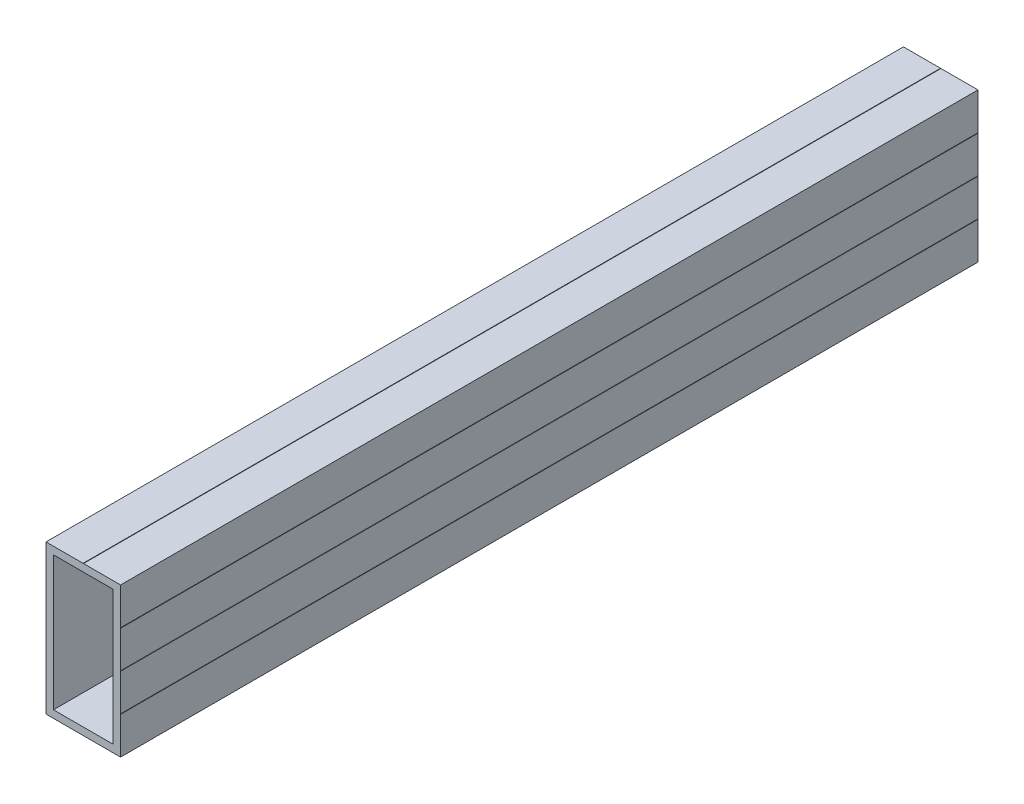
ISO-10303-21;
HEADER;
FILE_DESCRIPTION(('STEP AP214'),'2;1');
FILE_NAME('part.step','',(''),(''),'','','');
FILE_SCHEMA(('AUTOMOTIVE_DESIGN { 1 0 10303 214 1 1 1 1 }'));
ENDSEC;
DATA;
#1=APPLICATION_CONTEXT('core data for automotive mechanical design processes');
#2=APPLICATION_PROTOCOL_DEFINITION('international standard','automotive_design',2000,#1);
#3=PRODUCT_CONTEXT('',#1,'mechanical');
#4=PRODUCT('Part','Part','',(#3));
#5=PRODUCT_RELATED_PRODUCT_CATEGORY('part','',(#4));
#6=PRODUCT_DEFINITION_FORMATION('','',#4);
#7=PRODUCT_DEFINITION_CONTEXT('part definition',#1,'design');
#8=PRODUCT_DEFINITION('design','',#6,#7);
#9=PRODUCT_DEFINITION_SHAPE('','',#8);
#10=(LENGTH_UNIT() NAMED_UNIT(*) SI_UNIT(.MILLI.,.METRE.));
#11=(NAMED_UNIT(*) PLANE_ANGLE_UNIT() SI_UNIT($,.RADIAN.));
#12=(NAMED_UNIT(*) SI_UNIT($,.STERADIAN.) SOLID_ANGLE_UNIT());
#13=UNCERTAINTY_MEASURE_WITH_UNIT(LENGTH_MEASURE(1.E-05),#10,'distance_accuracy_value','');
#14=(GEOMETRIC_REPRESENTATION_CONTEXT(3) GLOBAL_UNCERTAINTY_ASSIGNED_CONTEXT((#13)) GLOBAL_UNIT_ASSIGNED_CONTEXT((#10,
#11,#12)) REPRESENTATION_CONTEXT('',''));
#15=CARTESIAN_POINT('',(0.,0.,0.));
#16=DIRECTION('',(0.,0.,1.));
#17=DIRECTION('',(1.,0.,0.));
#18=AXIS2_PLACEMENT_3D('',#15,#16,#17);
#19=CARTESIAN_POINT('',(-12.7,0.,0.));
#20=DIRECTION('',(1.,0.,0.));
#21=DIRECTION('',(0.,0.,-1.));
#22=AXIS2_PLACEMENT_3D('',#19,#20,#21);
#23=PLANE('',#22);
#24=DIRECTION('',(0.,0.,1.));
#25=VECTOR('',#24,1.);
#26=CARTESIAN_POINT('',(-12.7,25.4,-749.3));
#27=LINE('',#26,#25);
#28=CARTESIAN_POINT('',(-12.7,25.4,457.2));
#29=VERTEX_POINT('',#28);
#30=CARTESIAN_POINT('',(-12.7,25.4,749.3));
#31=VERTEX_POINT('',#30);
#32=EDGE_CURVE('E335',#29,#31,#27,.T.);
#33=ORIENTED_EDGE('',*,*,#32,.F.);
#34=DIRECTION('',(0.,-1.,0.));
#35=VECTOR('',#34,1.);
#36=CARTESIAN_POINT('',(-12.7,0.,457.2));
#37=LINE('',#36,#35);
#38=CARTESIAN_POINT('',(-12.7000000000132,12.7762,457.2));
#39=VERTEX_POINT('',#38);
#40=EDGE_CURVE('E408',#29,#39,#37,.T.);
#41=ORIENTED_EDGE('',*,*,#40,.T.);
#42=DIRECTION('',(0.,0.,1.));
#43=VECTOR('',#42,1.);
#44=CARTESIAN_POINT('',(-12.7000000000132,12.7762,-749.3));
#45=LINE('',#44,#43);
#46=CARTESIAN_POINT('',(-12.7000000000132,12.7762,749.3));
#47=VERTEX_POINT('',#46);
#48=EDGE_CURVE('E271',#39,#47,#45,.T.);
#49=ORIENTED_EDGE('',*,*,#48,.T.);
#50=DIRECTION('',(0.,-1.,0.));
#51=VECTOR('',#50,1.);
#52=CARTESIAN_POINT('',(-12.7,25.4,749.3));
#53=LINE('',#52,#51);
#54=EDGE_CURVE('E339',#31,#47,#53,.T.);
#55=ORIENTED_EDGE('',*,*,#54,.F.);
#56=EDGE_LOOP('',(#33,#41,#49,#55));
#57=FACE_BOUND('',#56,.T.);
#58=ADVANCED_FACE('F34',(#57),#23,.F.);
#59=DIRECTION('',(0.,0.,-1.));
#60=VECTOR('',#59,1.);
#61=CARTESIAN_POINT('',(-12.7,12.6238000000132,0.));
#62=LINE('',#61,#60);
#63=CARTESIAN_POINT('',(-12.7,12.6238000000132,457.2));
#64=VERTEX_POINT('',#63);
#65=CARTESIAN_POINT('',(-12.7,12.6238000000132,749.3));
#66=VERTEX_POINT('',#65);
#67=EDGE_CURVE('E273',#64,#66,#62,.F.);
#68=ORIENTED_EDGE('',*,*,#67,.F.);
#69=DIRECTION('',(0.,-1.,0.));
#70=VECTOR('',#69,1.);
#71=CARTESIAN_POINT('',(-12.7,0.,457.2));
#72=LINE('',#71,#70);
#73=CARTESIAN_POINT('',(-12.7,0.0761999999999976,457.2));
#74=VERTEX_POINT('',#73);
#75=EDGE_CURVE('E49',#64,#74,#72,.T.);
#76=ORIENTED_EDGE('',*,*,#75,.T.);
#77=DIRECTION('',(0.,0.,1.));
#78=VECTOR('',#77,1.);
#79=CARTESIAN_POINT('',(-12.7,0.0761999999999976,-749.3));
#80=LINE('',#79,#78);
#81=CARTESIAN_POINT('',(-12.7,0.0761999999999976,749.3));
#82=VERTEX_POINT('',#81);
#83=EDGE_CURVE('E279',#74,#82,#80,.T.);
#84=ORIENTED_EDGE('',*,*,#83,.T.);
#85=EDGE_CURVE('E343',#66,#82,#53,.T.);
#86=ORIENTED_EDGE('',*,*,#85,.F.);
#87=EDGE_LOOP('',(#68,#76,#84,#86));
#88=FACE_BOUND('',#87,.T.);
#89=ADVANCED_FACE('F513',(#88),#23,.F.);
#90=DIRECTION('',(0.,0.,-1.));
#91=VECTOR('',#90,1.);
#92=CARTESIAN_POINT('',(-12.7,-0.0761999999999985,0.));
#93=LINE('',#92,#91);
#94=CARTESIAN_POINT('',(-12.7,-0.0761999999999982,457.2));
#95=VERTEX_POINT('',#94);
#96=CARTESIAN_POINT('',(-12.7,-0.0761999999999985,749.3));
#97=VERTEX_POINT('',#96);
#98=EDGE_CURVE('E281',#95,#97,#93,.F.);
#99=ORIENTED_EDGE('',*,*,#98,.F.);
#100=DIRECTION('',(0.,-1.,0.));
#101=VECTOR('',#100,1.);
#102=CARTESIAN_POINT('',(-12.7,0.,457.2));
#103=LINE('',#102,#101);
#104=CARTESIAN_POINT('',(-12.7,-12.6238,457.2));
#105=VERTEX_POINT('',#104);
#106=EDGE_CURVE('E430',#95,#105,#103,.T.);
#107=ORIENTED_EDGE('',*,*,#106,.T.);
#108=DIRECTION('',(0.,0.,1.));
#109=VECTOR('',#108,1.);
#110=CARTESIAN_POINT('',(-12.7,-12.6238,-749.3));
#111=LINE('',#110,#109);
#112=CARTESIAN_POINT('',(-12.7,-12.6238,749.3));
#113=VERTEX_POINT('',#112);
#114=EDGE_CURVE('E290',#105,#113,#111,.T.);
#115=ORIENTED_EDGE('',*,*,#114,.T.);
#116=EDGE_CURVE('E596',#97,#113,#53,.T.);
#117=ORIENTED_EDGE('',*,*,#116,.F.);
#118=EDGE_LOOP('',(#99,#107,#115,#117));
#119=FACE_BOUND('',#118,.T.);
#120=ADVANCED_FACE('F505',(#119),#23,.F.);
#121=CARTESIAN_POINT('',(-12.7,-25.4,749.3));
#122=DIRECTION('',(0.,-1.,0.));
#123=DIRECTION('',(0.,0.,-1.));
#124=AXIS2_PLACEMENT_3D('',#121,#122,#123);
#125=PLANE('',#124);
#126=DIRECTION('',(-1.,0.,0.));
#127=VECTOR('',#126,1.);
#128=CARTESIAN_POINT('',(-12.7,-25.4,457.2));
#129=LINE('',#128,#127);
#130=CARTESIAN_POINT('',(-0.0762000000000089,-25.4,457.2));
#131=VERTEX_POINT('',#130);
#132=CARTESIAN_POINT('',(-12.7,-25.4,457.2));
#133=VERTEX_POINT('',#132);
#134=EDGE_CURVE('E452',#131,#133,#129,.T.);
#135=ORIENTED_EDGE('',*,*,#134,.F.);
#136=DIRECTION('',(0.,0.,1.));
#137=VECTOR('',#136,1.);
#138=CARTESIAN_POINT('',(-0.0762000000000087,-25.4,-749.3));
#139=LINE('',#138,#137);
#140=CARTESIAN_POINT('',(-0.0762000000000087,-25.4,749.3));
#141=VERTEX_POINT('',#140);
#142=EDGE_CURVE('E296',#131,#141,#139,.T.);
#143=ORIENTED_EDGE('',*,*,#142,.T.);
#144=DIRECTION('',(1.,0.,0.));
#145=VECTOR('',#144,1.);
#146=CARTESIAN_POINT('',(-12.7,-25.4,749.3));
#147=LINE('',#146,#145);
#148=CARTESIAN_POINT('',(-12.7,-25.4,749.3));
#149=VERTEX_POINT('',#148);
#150=EDGE_CURVE('E42',#149,#141,#147,.T.);
#151=ORIENTED_EDGE('',*,*,#150,.F.);
#152=DIRECTION('',(0.,0.,-1.));
#153=VECTOR('',#152,1.);
#154=CARTESIAN_POINT('',(-12.7,-25.4,749.3));
#155=LINE('',#154,#153);
#156=EDGE_CURVE('E342',#149,#133,#155,.T.);
#157=ORIENTED_EDGE('',*,*,#156,.T.);
#158=EDGE_LOOP('',(#135,#143,#151,#157));
#159=FACE_BOUND('',#158,.T.);
#160=ADVANCED_FACE('F510',(#159),#125,.T.);
#161=CARTESIAN_POINT('',(12.7,0.,0.));
#162=DIRECTION('',(1.,0.,0.));
#163=DIRECTION('',(0.,0.,-1.));
#164=AXIS2_PLACEMENT_3D('',#161,#162,#163);
#165=PLANE('',#164);
#166=DIRECTION('',(0.,-1.,0.));
#167=VECTOR('',#166,1.);
#168=CARTESIAN_POINT('',(12.7,0.,457.2));
#169=LINE('',#168,#167);
#170=CARTESIAN_POINT('',(12.7,-12.7762,457.2));
#171=VERTEX_POINT('',#170);
#172=CARTESIAN_POINT('',(12.7,-25.4,457.2));
#173=VERTEX_POINT('',#172);
#174=EDGE_CURVE('E476',#171,#173,#169,.T.);
#175=ORIENTED_EDGE('',*,*,#174,.F.);
#176=DIRECTION('',(0.,0.,1.));
#177=VECTOR('',#176,1.);
#178=CARTESIAN_POINT('',(12.7,-12.7762,-749.3));
#179=LINE('',#178,#177);
#180=CARTESIAN_POINT('',(12.7,-12.7762,749.3));
#181=VERTEX_POINT('',#180);
#182=EDGE_CURVE('E305',#171,#181,#179,.T.);
#183=ORIENTED_EDGE('',*,*,#182,.T.);
#184=DIRECTION('',(0.,-1.,0.));
#185=VECTOR('',#184,1.);
#186=CARTESIAN_POINT('',(12.7,25.4,749.3));
#187=LINE('',#186,#185);
#188=CARTESIAN_POINT('',(12.7,-25.4,749.3));
#189=VERTEX_POINT('',#188);
#190=EDGE_CURVE('E349',#181,#189,#187,.T.);
#191=ORIENTED_EDGE('',*,*,#190,.T.);
#192=DIRECTION('',(0.,0.,-1.));
#193=VECTOR('',#192,1.);
#194=CARTESIAN_POINT('',(12.7,-25.4,749.3));
#195=LINE('',#194,#193);
#196=EDGE_CURVE('E338',#189,#173,#195,.T.);
#197=ORIENTED_EDGE('',*,*,#196,.T.);
#198=EDGE_LOOP('',(#175,#183,#191,#197));
#199=FACE_BOUND('',#198,.T.);
#200=ADVANCED_FACE('F525',(#199),#165,.T.);
#201=DIRECTION('',(0.,-1.,0.));
#202=VECTOR('',#201,1.);
#203=CARTESIAN_POINT('',(12.7,0.,457.2));
#204=LINE('',#203,#202);
#205=CARTESIAN_POINT('',(12.7,-0.0762000000000003,457.2));
#206=VERTEX_POINT('',#205);
#207=CARTESIAN_POINT('',(12.7,-12.6238,457.2));
#208=VERTEX_POINT('',#207);
#209=EDGE_CURVE('E463',#206,#208,#204,.T.);
#210=ORIENTED_EDGE('',*,*,#209,.F.);
#211=DIRECTION('',(0.,0.,1.));
#212=VECTOR('',#211,1.);
#213=CARTESIAN_POINT('',(12.7,-0.0762000000000003,-749.3));
#214=LINE('',#213,#212);
#215=CARTESIAN_POINT('',(12.7,-0.0762000000000003,749.3));
#216=VERTEX_POINT('',#215);
#217=EDGE_CURVE('E313',#206,#216,#214,.T.);
#218=ORIENTED_EDGE('',*,*,#217,.T.);
#219=CARTESIAN_POINT('',(12.7,-12.6238,749.3));
#220=VERTEX_POINT('',#219);
#221=EDGE_CURVE('E557',#216,#220,#187,.T.);
#222=ORIENTED_EDGE('',*,*,#221,.T.);
#223=DIRECTION('',(0.,0.,-1.));
#224=VECTOR('',#223,1.);
#225=CARTESIAN_POINT('',(12.7,-12.6238,0.));
#226=LINE('',#225,#224);
#227=EDGE_CURVE('E307',#208,#220,#226,.F.);
#228=ORIENTED_EDGE('',*,*,#227,.F.);
#229=EDGE_LOOP('',(#210,#218,#222,#228));
#230=FACE_BOUND('',#229,.T.);
#231=ADVANCED_FACE('F534',(#230),#165,.T.);
#232=DIRECTION('',(0.,-1.,0.));
#233=VECTOR('',#232,1.);
#234=CARTESIAN_POINT('',(12.7,0.,457.2));
#235=LINE('',#234,#233);
#236=CARTESIAN_POINT('',(12.6999999999868,12.6238,457.2));
#237=VERTEX_POINT('',#236);
#238=CARTESIAN_POINT('',(12.7,0.0761999999999985,457.2));
#239=VERTEX_POINT('',#238);
#240=EDGE_CURVE('E450',#237,#239,#235,.T.);
#241=ORIENTED_EDGE('',*,*,#240,.F.);
#242=DIRECTION('',(0.,0.,1.));
#243=VECTOR('',#242,1.);
#244=CARTESIAN_POINT('',(12.6999999999868,12.6238,-749.3));
#245=LINE('',#244,#243);
#246=CARTESIAN_POINT('',(12.6999999999868,12.6238,749.3));
#247=VERTEX_POINT('',#246);
#248=EDGE_CURVE('E324',#237,#247,#245,.T.);
#249=ORIENTED_EDGE('',*,*,#248,.T.);
#250=CARTESIAN_POINT('',(12.7,0.0761999999999985,749.3));
#251=VERTEX_POINT('',#250);
#252=EDGE_CURVE('E353',#247,#251,#187,.T.);
#253=ORIENTED_EDGE('',*,*,#252,.T.);
#254=DIRECTION('',(0.,0.,-1.));
#255=VECTOR('',#254,1.);
#256=CARTESIAN_POINT('',(12.7,0.0761999999999985,0.));
#257=LINE('',#256,#255);
#258=EDGE_CURVE('E315',#239,#251,#257,.F.);
#259=ORIENTED_EDGE('',*,*,#258,.F.);
#260=EDGE_LOOP('',(#241,#249,#253,#259));
#261=FACE_BOUND('',#260,.T.);
#262=ADVANCED_FACE('F526',(#261),#165,.T.);
#263=CARTESIAN_POINT('',(-12.7,25.4,-749.3));
#264=DIRECTION('',(0.,1.,0.));
#265=DIRECTION('',(0.,0.,1.));
#266=AXIS2_PLACEMENT_3D('',#263,#264,#265);
#267=PLANE('',#266);
#268=DIRECTION('',(1.,0.,0.));
#269=VECTOR('',#268,1.);
#270=CARTESIAN_POINT('',(-12.7,25.4,457.2));
#271=LINE('',#270,#269);
#272=CARTESIAN_POINT('',(0.0761999999999968,25.4,457.2));
#273=VERTEX_POINT('',#272);
#274=CARTESIAN_POINT('',(12.7,25.4,457.2));
#275=VERTEX_POINT('',#274);
#276=EDGE_CURVE('E428',#273,#275,#271,.T.);
#277=ORIENTED_EDGE('',*,*,#276,.F.);
#278=DIRECTION('',(0.,0.,1.));
#279=VECTOR('',#278,1.);
#280=CARTESIAN_POINT('',(0.0761999999999968,25.4,-749.3));
#281=LINE('',#280,#279);
#282=CARTESIAN_POINT('',(0.0761999999999968,25.4,749.3));
#283=VERTEX_POINT('',#282);
#284=EDGE_CURVE('E329',#273,#283,#281,.T.);
#285=ORIENTED_EDGE('',*,*,#284,.T.);
#286=DIRECTION('',(1.,0.,0.));
#287=VECTOR('',#286,1.);
#288=CARTESIAN_POINT('',(-12.7,25.4,749.3));
#289=LINE('',#288,#287);
#290=CARTESIAN_POINT('',(12.7,25.4,749.3));
#291=VERTEX_POINT('',#290);
#292=EDGE_CURVE('E346',#283,#291,#289,.T.);
#293=ORIENTED_EDGE('',*,*,#292,.T.);
#294=DIRECTION('',(0.,0.,1.));
#295=VECTOR('',#294,1.);
#296=CARTESIAN_POINT('',(12.7,25.4,-749.3));
#297=LINE('',#296,#295);
#298=EDGE_CURVE('E347',#275,#291,#297,.T.);
#299=ORIENTED_EDGE('',*,*,#298,.F.);
#300=EDGE_LOOP('',(#277,#285,#293,#299));
#301=FACE_BOUND('',#300,.T.);
#302=ADVANCED_FACE('F537',(#301),#267,.T.);
#303=DIRECTION('',(1.,0.,0.));
#304=VECTOR('',#303,1.);
#305=CARTESIAN_POINT('',(-12.7,25.4,457.2));
#306=LINE('',#305,#304);
#307=CARTESIAN_POINT('',(-0.0761999999999985,25.4,457.2));
#308=VERTEX_POINT('',#307);
#309=EDGE_CURVE('E413',#29,#308,#306,.T.);
#310=ORIENTED_EDGE('',*,*,#309,.F.);
#311=ORIENTED_EDGE('',*,*,#32,.T.);
#312=CARTESIAN_POINT('',(-0.0761999999999985,25.4,749.3));
#313=VERTEX_POINT('',#312);
#314=EDGE_CURVE('E359',#31,#313,#289,.T.);
#315=ORIENTED_EDGE('',*,*,#314,.T.);
#316=DIRECTION('',(0.,0.,1.));
#317=VECTOR('',#316,1.);
#318=CARTESIAN_POINT('',(-0.0761999999999985,25.4,-749.3));
#319=LINE('',#318,#317);
#320=EDGE_CURVE('E331',#308,#313,#319,.T.);
#321=ORIENTED_EDGE('',*,*,#320,.F.);
#322=EDGE_LOOP('',(#310,#311,#315,#321));
#323=FACE_BOUND('',#322,.T.);
#324=ADVANCED_FACE('F507',(#323),#267,.T.);
#325=DIRECTION('',(-1.,0.,0.));
#326=VECTOR('',#325,1.);
#327=CARTESIAN_POINT('',(-12.7,-25.4,457.2));
#328=LINE('',#327,#326);
#329=CARTESIAN_POINT('',(0.0761999999999916,-25.4,457.2));
#330=VERTEX_POINT('',#329);
#331=EDGE_CURVE('E474',#173,#330,#328,.T.);
#332=ORIENTED_EDGE('',*,*,#331,.F.);
#333=ORIENTED_EDGE('',*,*,#196,.F.);
#334=CARTESIAN_POINT('',(0.0761999999999898,-25.4,749.3));
#335=VERTEX_POINT('',#334);
#336=EDGE_CURVE('E358',#335,#189,#147,.T.);
#337=ORIENTED_EDGE('',*,*,#336,.F.);
#338=DIRECTION('',(0.,0.,1.));
#339=VECTOR('',#338,1.);
#340=CARTESIAN_POINT('',(0.0761999999999916,-25.4,-749.3));
#341=LINE('',#340,#339);
#342=EDGE_CURVE('E300',#330,#335,#341,.T.);
#343=ORIENTED_EDGE('',*,*,#342,.F.);
#344=EDGE_LOOP('',(#332,#333,#337,#343));
#345=FACE_BOUND('',#344,.T.);
#346=ADVANCED_FACE('F495',(#345),#125,.T.);
#347=CARTESIAN_POINT('',(-12.7,25.4,749.3));
#348=DIRECTION('',(0.,0.,1.));
#349=DIRECTION('',(1.,0.,0.));
#350=AXIS2_PLACEMENT_3D('',#347,#348,#349);
#351=PLANE('',#350);
#352=DIRECTION('',(1.,0.,0.));
#353=VECTOR('',#352,1.);
#354=CARTESIAN_POINT('',(-10.16,-22.86,749.3));
#355=LINE('',#354,#353);
#356=CARTESIAN_POINT('',(-10.16,-22.86,749.3));
#357=VERTEX_POINT('',#356);
#358=CARTESIAN_POINT('',(10.16,-22.86,749.3));
#359=VERTEX_POINT('',#358);
#360=EDGE_CURVE('E478',#357,#359,#355,.T.);
#361=ORIENTED_EDGE('',*,*,#360,.F.);
#362=DIRECTION('',(0.,-1.,0.));
#363=VECTOR('',#362,1.);
#364=CARTESIAN_POINT('',(-10.16,22.86,749.3));
#365=LINE('',#364,#363);
#366=CARTESIAN_POINT('',(-10.16,22.86,749.3));
#367=VERTEX_POINT('',#366);
#368=EDGE_CURVE('E263',#367,#357,#365,.T.);
#369=ORIENTED_EDGE('',*,*,#368,.F.);
#370=DIRECTION('',(-1.,0.,0.));
#371=VECTOR('',#370,1.);
#372=CARTESIAN_POINT('',(10.16,22.86,749.3));
#373=LINE('',#372,#371);
#374=CARTESIAN_POINT('',(10.16,22.86,749.3));
#375=VERTEX_POINT('',#374);
#376=EDGE_CURVE('E482',#375,#367,#373,.T.);
#377=ORIENTED_EDGE('',*,*,#376,.F.);
#378=DIRECTION('',(0.,1.,0.));
#379=VECTOR('',#378,1.);
#380=CARTESIAN_POINT('',(10.16,-22.86,749.3));
#381=LINE('',#380,#379);
#382=EDGE_CURVE('E257',#359,#375,#381,.T.);
#383=ORIENTED_EDGE('',*,*,#382,.F.);
#384=EDGE_LOOP('',(#361,#369,#377,#383));
#385=FACE_BOUND('',#384,.T.);
#386=DIRECTION('',(-0.707106781186539,0.707106781186555,0.));
#387=VECTOR('',#386,1.);
#388=CARTESIAN_POINT('',(-12.5476000000263,12.6238000000132,749.3));
#389=LINE('',#388,#387);
#390=CARTESIAN_POINT('',(-12.6238000000066,12.6999999999934,749.3));
#391=VERTEX_POINT('',#390);
#392=EDGE_CURVE('E267',#391,#47,#389,.T.);
#393=ORIENTED_EDGE('',*,*,#392,.F.);
#394=DIRECTION('',(-0.707106781247692,-0.707106781125403,0.));
#395=VECTOR('',#394,1.);
#396=CARTESIAN_POINT('',(-6.3119000000066,19.0118999989018,749.3));
#397=LINE('',#396,#395);
#398=EDGE_CURVE('E270',#66,#391,#397,.F.);
#399=ORIENTED_EDGE('',*,*,#398,.F.);
#400=ORIENTED_EDGE('',*,*,#85,.T.);
#401=DIRECTION('',(-1.,0.,0.));
#402=VECTOR('',#401,1.);
#403=CARTESIAN_POINT('',(-12.5476,0.0761999999999985,749.3));
#404=LINE('',#403,#402);
#405=CARTESIAN_POINT('',(-12.5475999999737,0.0761999999999985,749.3));
#406=VERTEX_POINT('',#405);
#407=EDGE_CURVE('E274',#406,#82,#404,.T.);
#408=ORIENTED_EDGE('',*,*,#407,.F.);
#409=DIRECTION('',(-0.707106781247692,-0.707106781125403,0.));
#410=VECTOR('',#409,1.);
#411=CARTESIAN_POINT('',(0.0380999999999923,12.661899997797,749.3));
#412=LINE('',#411,#410);
#413=EDGE_CURVE('E277',#97,#406,#412,.F.);
#414=ORIENTED_EDGE('',*,*,#413,.F.);
#415=ORIENTED_EDGE('',*,*,#116,.T.);
#416=DIRECTION('',(-0.707106781186551,0.707106781186543,0.));
#417=VECTOR('',#416,1.);
#418=CARTESIAN_POINT('',(-12.5476,-12.7762,749.3));
#419=LINE('',#418,#417);
#420=CARTESIAN_POINT('',(-12.6238,-12.7,749.3));
#421=VERTEX_POINT('',#420);
#422=EDGE_CURVE('E282',#421,#113,#419,.T.);
#423=ORIENTED_EDGE('',*,*,#422,.F.);
#424=DIRECTION('',(-0.707106781186537,-0.707106781186558,0.));
#425=VECTOR('',#424,1.);
#426=CARTESIAN_POINT('',(6.38809999999999,6.31190000000056,749.3));
#427=LINE('',#426,#425);
#428=CARTESIAN_POINT('',(-12.7,-12.7762,749.3));
#429=VERTEX_POINT('',#428);
#430=EDGE_CURVE('E285',#429,#421,#427,.F.);
#431=ORIENTED_EDGE('',*,*,#430,.F.);
#432=EDGE_CURVE('E337',#429,#149,#53,.T.);
#433=ORIENTED_EDGE('',*,*,#432,.T.);
#434=ORIENTED_EDGE('',*,*,#150,.T.);
#435=DIRECTION('',(0.707106781186552,0.707106781186544,0.));
#436=VECTOR('',#435,1.);
#437=CARTESIAN_POINT('',(19.0118999999999,-6.31190000000029,749.3));
#438=LINE('',#437,#436);
#439=CARTESIAN_POINT('',(0.,-25.3238,749.3));
#440=VERTEX_POINT('',#439);
#441=EDGE_CURVE('E295',#440,#141,#438,.F.);
#442=ORIENTED_EDGE('',*,*,#441,.F.);
#443=DIRECTION('',(-0.707106781186547,0.707106781186548,0.));
#444=VECTOR('',#443,1.);
#445=CARTESIAN_POINT('',(0.0761999999999916,-25.4,749.3));
#446=LINE('',#445,#444);
#447=EDGE_CURVE('E292',#335,#440,#446,.T.);
#448=ORIENTED_EDGE('',*,*,#447,.F.);
#449=ORIENTED_EDGE('',*,*,#336,.T.);
#450=ORIENTED_EDGE('',*,*,#190,.F.);
#451=DIRECTION('',(0.707106781186539,-0.707106781186556,0.));
#452=VECTOR('',#451,1.);
#453=CARTESIAN_POINT('',(12.5476,-12.6238,749.3));
#454=LINE('',#453,#452);
#455=CARTESIAN_POINT('',(12.6238,-12.7,749.3));
#456=VERTEX_POINT('',#455);
#457=EDGE_CURVE('E298',#456,#181,#454,.T.);
#458=ORIENTED_EDGE('',*,*,#457,.F.);
#459=DIRECTION('',(0.707106781186553,0.707106781186542,0.));
#460=VECTOR('',#459,1.);
#461=CARTESIAN_POINT('',(19.0118999999998,-6.3119000000003,749.3));
#462=LINE('',#461,#460);
#463=EDGE_CURVE('E304',#220,#456,#462,.F.);
#464=ORIENTED_EDGE('',*,*,#463,.F.);
#465=ORIENTED_EDGE('',*,*,#221,.F.);
#466=DIRECTION('',(1.,0.,0.));
#467=VECTOR('',#466,1.);
#468=CARTESIAN_POINT('',(12.5476,-0.0761999999999985,749.3));
#469=LINE('',#468,#467);
#470=CARTESIAN_POINT('',(12.5476,-0.0761999999999985,749.3));
#471=VERTEX_POINT('',#470);
#472=EDGE_CURVE('E308',#471,#216,#469,.T.);
#473=ORIENTED_EDGE('',*,*,#472,.F.);
#474=DIRECTION('',(0.707106781186553,0.707106781186542,0.));
#475=VECTOR('',#474,1.);
#476=CARTESIAN_POINT('',(12.6618999999998,0.038099999999798,749.3));
#477=LINE('',#476,#475);
#478=EDGE_CURVE('E311',#251,#471,#477,.F.);
#479=ORIENTED_EDGE('',*,*,#478,.F.);
#480=ORIENTED_EDGE('',*,*,#252,.F.);
#481=DIRECTION('',(0.707106781186544,-0.707106781186552,0.));
#482=VECTOR('',#481,1.);
#483=CARTESIAN_POINT('',(12.5475999999736,12.7762000000132,749.3));
#484=LINE('',#483,#482);
#485=CARTESIAN_POINT('',(12.6237999999868,12.7,749.3));
#486=VERTEX_POINT('',#485);
#487=EDGE_CURVE('E316',#486,#247,#484,.T.);
#488=ORIENTED_EDGE('',*,*,#487,.F.);
#489=DIRECTION('',(0.707106781125415,0.707106781247681,0.));
#490=VECTOR('',#489,1.);
#491=CARTESIAN_POINT('',(6.31190000218278,6.38810000110456,749.3));
#492=LINE('',#491,#490);
#493=CARTESIAN_POINT('',(12.6999999999868,12.7762000000132,749.3));
#494=VERTEX_POINT('',#493);
#495=EDGE_CURVE('E319',#494,#486,#492,.F.);
#496=ORIENTED_EDGE('',*,*,#495,.F.);
#497=EDGE_CURVE('E350',#291,#494,#187,.T.);
#498=ORIENTED_EDGE('',*,*,#497,.F.);
#499=ORIENTED_EDGE('',*,*,#292,.F.);
#500=DIRECTION('',(-0.707106781186552,-0.707106781186543,0.));
#501=VECTOR('',#500,1.);
#502=CARTESIAN_POINT('',(-6.31190000000008,19.0119,749.3));
#503=LINE('',#502,#501);
#504=CARTESIAN_POINT('',(0.,25.3238,749.3));
#505=VERTEX_POINT('',#504);
#506=EDGE_CURVE('E330',#505,#283,#503,.F.);
#507=ORIENTED_EDGE('',*,*,#506,.F.);
#508=DIRECTION('',(0.707106781186548,-0.707106781186547,0.));
#509=VECTOR('',#508,1.);
#510=CARTESIAN_POINT('',(-0.0761999999999985,25.4,749.3));
#511=LINE('',#510,#509);
#512=EDGE_CURVE('E326',#313,#505,#511,.T.);
#513=ORIENTED_EDGE('',*,*,#512,.F.);
#514=ORIENTED_EDGE('',*,*,#314,.F.);
#515=ORIENTED_EDGE('',*,*,#54,.T.);
#516=EDGE_LOOP('',(#393,#399,#400,#408,#414,#415,#423,#431,#433,#434,#442,#448,#449,#450,#458,
#464,#465,#473,#479,#480,#488,#496,#498,#499,#507,#513,#514,#515));
#517=FACE_BOUND('',#516,.T.);
#518=ADVANCED_FACE('F401',(#385,#517),#351,.T.);
#519=DIRECTION('',(0.,0.,1.));
#520=VECTOR('',#519,1.);
#521=CARTESIAN_POINT('',(-12.7,-12.7762,-749.3));
#522=LINE('',#521,#520);
#523=CARTESIAN_POINT('',(-12.7,-12.7762,457.2));
#524=VERTEX_POINT('',#523);
#525=EDGE_CURVE('E287',#524,#429,#522,.T.);
#526=ORIENTED_EDGE('',*,*,#525,.F.);
#527=DIRECTION('',(0.,-1.,0.));
#528=VECTOR('',#527,1.);
#529=CARTESIAN_POINT('',(-12.7,0.,457.2));
#530=LINE('',#529,#528);
#531=EDGE_CURVE('E447',#524,#133,#530,.T.);
#532=ORIENTED_EDGE('',*,*,#531,.T.);
#533=ORIENTED_EDGE('',*,*,#156,.F.);
#534=ORIENTED_EDGE('',*,*,#432,.F.);
#535=EDGE_LOOP('',(#526,#532,#533,#534));
#536=FACE_BOUND('',#535,.T.);
#537=ADVANCED_FACE('F494',(#536),#23,.F.);
#538=DIRECTION('',(0.,-1.,0.));
#539=VECTOR('',#538,1.);
#540=CARTESIAN_POINT('',(12.7,0.,457.2));
#541=LINE('',#540,#539);
#542=CARTESIAN_POINT('',(12.7,12.7762000000132,457.2));
#543=VERTEX_POINT('',#542);
#544=EDGE_CURVE('E436',#275,#543,#541,.T.);
#545=ORIENTED_EDGE('',*,*,#544,.F.);
#546=ORIENTED_EDGE('',*,*,#298,.T.);
#547=ORIENTED_EDGE('',*,*,#497,.T.);
#548=DIRECTION('',(0.,0.,1.));
#549=VECTOR('',#548,1.);
#550=CARTESIAN_POINT('',(12.6999999999868,12.7762000000132,-749.3));
#551=LINE('',#550,#549);
#552=EDGE_CURVE('E321',#543,#494,#551,.T.);
#553=ORIENTED_EDGE('',*,*,#552,.F.);
#554=EDGE_LOOP('',(#545,#546,#547,#553));
#555=FACE_BOUND('',#554,.T.);
#556=ADVANCED_FACE('F502',(#555),#165,.T.);
#557=CARTESIAN_POINT('',(0.0761999999999968,25.4,-749.3));
#558=DIRECTION('',(-0.707106781186543,0.707106781186552,0.));
#559=DIRECTION('',(-0.707106781186552,-0.707106781186543,0.));
#560=AXIS2_PLACEMENT_3D('',#557,#558,#559);
#561=PLANE('',#560);
#562=ORIENTED_EDGE('',*,*,#284,.F.);
#563=DIRECTION('',(0.707106781186552,0.707106781186543,0.));
#564=VECTOR('',#563,1.);
#565=CARTESIAN_POINT('',(0.0761999999999968,25.4,457.2));
#566=LINE('',#565,#564);
#567=CARTESIAN_POINT('',(0.,25.3238,457.2));
#568=VERTEX_POINT('',#567);
#569=EDGE_CURVE('E425',#273,#568,#566,.F.);
#570=ORIENTED_EDGE('',*,*,#569,.T.);
#571=DIRECTION('',(0.,0.,-1.));
#572=VECTOR('',#571,1.);
#573=CARTESIAN_POINT('',(0.,25.3238,-749.3));
#574=LINE('',#573,#572);
#575=EDGE_CURVE('E333',#568,#505,#574,.F.);
#576=ORIENTED_EDGE('',*,*,#575,.T.);
#577=ORIENTED_EDGE('',*,*,#506,.T.);
#578=EDGE_LOOP('',(#562,#570,#576,#577));
#579=FACE_BOUND('',#578,.T.);
#580=ADVANCED_FACE('F523',(#579),#561,.T.);
#581=CARTESIAN_POINT('',(-0.0761999999999985,25.4,-749.3));
#582=DIRECTION('',(-0.707106781186547,-0.707106781186547,0.));
#583=DIRECTION('',(0.707106781186548,-0.707106781186548,0.));
#584=AXIS2_PLACEMENT_3D('',#581,#582,#583);
#585=PLANE('',#584);
#586=ORIENTED_EDGE('',*,*,#575,.F.);
#587=DIRECTION('',(-0.707106781186548,0.707106781186548,0.));
#588=VECTOR('',#587,1.);
#589=CARTESIAN_POINT('',(-0.0761999999999985,25.4,457.2));
#590=LINE('',#589,#588);
#591=EDGE_CURVE('E422',#568,#308,#590,.T.);
#592=ORIENTED_EDGE('',*,*,#591,.T.);
#593=ORIENTED_EDGE('',*,*,#320,.T.);
#594=ORIENTED_EDGE('',*,*,#512,.T.);
#595=EDGE_LOOP('',(#586,#592,#593,#594));
#596=FACE_BOUND('',#595,.T.);
#597=ADVANCED_FACE('F520',(#596),#585,.F.);
#598=CARTESIAN_POINT('',(12.5475999999736,12.7762000000132,-749.3));
#599=DIRECTION('',(-0.707106781186551,-0.707106781186544,0.));
#600=DIRECTION('',(0.707106781186544,-0.707106781186551,0.));
#601=AXIS2_PLACEMENT_3D('',#598,#599,#600);
#602=PLANE('',#601);
#603=ORIENTED_EDGE('',*,*,#248,.F.);
#604=DIRECTION('',(-0.707106781186544,0.707106781186551,0.));
#605=VECTOR('',#604,1.);
#606=CARTESIAN_POINT('',(12.5475999999736,12.7762000000132,457.2));
#607=LINE('',#606,#605);
#608=CARTESIAN_POINT('',(12.6237999999868,12.7,457.2));
#609=VERTEX_POINT('',#608);
#610=EDGE_CURVE('E444',#237,#609,#607,.T.);
#611=ORIENTED_EDGE('',*,*,#610,.T.);
#612=DIRECTION('',(0.,0.,-1.));
#613=VECTOR('',#612,1.);
#614=CARTESIAN_POINT('',(12.6237999999868,12.7,-749.3));
#615=LINE('',#614,#613);
#616=EDGE_CURVE('E323',#609,#486,#615,.F.);
#617=ORIENTED_EDGE('',*,*,#616,.T.);
#618=ORIENTED_EDGE('',*,*,#487,.T.);
#619=EDGE_LOOP('',(#603,#611,#617,#618));
#620=FACE_BOUND('',#619,.T.);
#621=ADVANCED_FACE('F550',(#620),#602,.F.);
#622=CARTESIAN_POINT('',(12.6999999999868,12.7762000000132,-749.3));
#623=DIRECTION('',(0.70710678124768,-0.707106781125414,0.));
#624=DIRECTION('',(0.707106781125415,0.707106781247681,0.));
#625=AXIS2_PLACEMENT_3D('',#622,#623,#624);
#626=PLANE('',#625);
#627=ORIENTED_EDGE('',*,*,#616,.F.);
#628=DIRECTION('',(-0.707106781125415,-0.707106781247681,0.));
#629=VECTOR('',#628,1.);
#630=CARTESIAN_POINT('',(12.6999999999868,12.7762000000132,457.2));
#631=LINE('',#630,#629);
#632=EDGE_CURVE('E441',#609,#543,#631,.F.);
#633=ORIENTED_EDGE('',*,*,#632,.T.);
#634=ORIENTED_EDGE('',*,*,#552,.T.);
#635=ORIENTED_EDGE('',*,*,#495,.T.);
#636=EDGE_LOOP('',(#627,#633,#634,#635));
#637=FACE_BOUND('',#636,.T.);
#638=ADVANCED_FACE('F627',(#637),#626,.T.);
#639=CARTESIAN_POINT('',(12.5476,-0.0761999999999985,-749.3));
#640=DIRECTION('',(0.,-1.,0.));
#641=DIRECTION('',(1.,0.,0.));
#642=AXIS2_PLACEMENT_3D('',#639,#640,#641);
#643=PLANE('',#642);
#644=ORIENTED_EDGE('',*,*,#217,.F.);
#645=DIRECTION('',(-1.,0.,0.));
#646=VECTOR('',#645,1.);
#647=CARTESIAN_POINT('',(12.5476,-0.0761999999999985,457.2));
#648=LINE('',#647,#646);
#649=CARTESIAN_POINT('',(12.5476,-0.0761999999999975,457.2));
#650=VERTEX_POINT('',#649);
#651=EDGE_CURVE('E460',#206,#650,#648,.T.);
#652=ORIENTED_EDGE('',*,*,#651,.T.);
#653=DIRECTION('',(0.,0.,-1.));
#654=VECTOR('',#653,1.);
#655=CARTESIAN_POINT('',(12.5476,-0.0761999999999985,0.));
#656=LINE('',#655,#654);
#657=EDGE_CURVE('E320',#650,#471,#656,.F.);
#658=ORIENTED_EDGE('',*,*,#657,.T.);
#659=ORIENTED_EDGE('',*,*,#472,.T.);
#660=EDGE_LOOP('',(#644,#652,#658,#659));
#661=FACE_BOUND('',#660,.T.);
#662=ADVANCED_FACE('F625',(#661),#643,.F.);
#663=CARTESIAN_POINT('',(12.7,0.0761999999999985,0.));
#664=DIRECTION('',(0.707106781186542,-0.707106781186553,0.));
#665=DIRECTION('',(0.707106781186553,0.707106781186542,0.));
#666=AXIS2_PLACEMENT_3D('',#663,#664,#665);
#667=PLANE('',#666);
#668=ORIENTED_EDGE('',*,*,#657,.F.);
#669=DIRECTION('',(-0.707106781186553,-0.707106781186542,0.));
#670=VECTOR('',#669,1.);
#671=CARTESIAN_POINT('',(12.7,0.0761999999999985,457.2));
#672=LINE('',#671,#670);
#673=EDGE_CURVE('E457',#650,#239,#672,.F.);
#674=ORIENTED_EDGE('',*,*,#673,.T.);
#675=ORIENTED_EDGE('',*,*,#258,.T.);
#676=ORIENTED_EDGE('',*,*,#478,.T.);
#677=EDGE_LOOP('',(#668,#674,#675,#676));
#678=FACE_BOUND('',#677,.T.);
#679=ADVANCED_FACE('F623',(#678),#667,.T.);
#680=CARTESIAN_POINT('',(12.5476,-12.6238,-749.3));
#681=DIRECTION('',(-0.707106781186555,-0.707106781186539,0.));
#682=DIRECTION('',(0.70710678118654,-0.707106781186556,0.));
#683=AXIS2_PLACEMENT_3D('',#680,#681,#682);
#684=PLANE('',#683);
#685=ORIENTED_EDGE('',*,*,#182,.F.);
#686=DIRECTION('',(-0.70710678118654,0.707106781186556,0.));
#687=VECTOR('',#686,1.);
#688=CARTESIAN_POINT('',(12.5476,-12.6238,457.2));
#689=LINE('',#688,#687);
#690=CARTESIAN_POINT('',(12.6238,-12.7,457.2));
#691=VERTEX_POINT('',#690);
#692=EDGE_CURVE('E471',#171,#691,#689,.T.);
#693=ORIENTED_EDGE('',*,*,#692,.T.);
#694=DIRECTION('',(0.,0.,-1.));
#695=VECTOR('',#694,1.);
#696=CARTESIAN_POINT('',(12.6238,-12.7,0.));
#697=LINE('',#696,#695);
#698=EDGE_CURVE('E312',#691,#456,#697,.F.);
#699=ORIENTED_EDGE('',*,*,#698,.T.);
#700=ORIENTED_EDGE('',*,*,#457,.T.);
#701=EDGE_LOOP('',(#685,#693,#699,#700));
#702=FACE_BOUND('',#701,.T.);
#703=ADVANCED_FACE('F619',(#702),#684,.F.);
#704=CARTESIAN_POINT('',(12.7,-12.6238,0.));
#705=DIRECTION('',(0.707106781186542,-0.707106781186553,0.));
#706=DIRECTION('',(0.707106781186553,0.707106781186542,0.));
#707=AXIS2_PLACEMENT_3D('',#704,#705,#706);
#708=PLANE('',#707);
#709=ORIENTED_EDGE('',*,*,#698,.F.);
#710=DIRECTION('',(-0.707106781186553,-0.707106781186542,0.));
#711=VECTOR('',#710,1.);
#712=CARTESIAN_POINT('',(12.7,-12.6238,457.2));
#713=LINE('',#712,#711);
#714=EDGE_CURVE('E468',#691,#208,#713,.F.);
#715=ORIENTED_EDGE('',*,*,#714,.T.);
#716=ORIENTED_EDGE('',*,*,#227,.T.);
#717=ORIENTED_EDGE('',*,*,#463,.T.);
#718=EDGE_LOOP('',(#709,#715,#716,#717));
#719=FACE_BOUND('',#718,.T.);
#720=ADVANCED_FACE('F622',(#719),#708,.T.);
#721=CARTESIAN_POINT('',(-0.0762000000000087,-25.4,-749.3));
#722=DIRECTION('',(0.707106781186543,-0.707106781186551,0.));
#723=DIRECTION('',(0.707106781186552,0.707106781186544,0.));
#724=AXIS2_PLACEMENT_3D('',#721,#722,#723);
#725=PLANE('',#724);
#726=ORIENTED_EDGE('',*,*,#142,.F.);
#727=DIRECTION('',(-0.707106781186552,-0.707106781186544,0.));
#728=VECTOR('',#727,1.);
#729=CARTESIAN_POINT('',(-0.0762000000000087,-25.4,457.2));
#730=LINE('',#729,#728);
#731=CARTESIAN_POINT('',(0.,-25.3238,457.2));
#732=VERTEX_POINT('',#731);
#733=EDGE_CURVE('E454',#131,#732,#730,.F.);
#734=ORIENTED_EDGE('',*,*,#733,.T.);
#735=DIRECTION('',(0.,0.,-1.));
#736=VECTOR('',#735,1.);
#737=CARTESIAN_POINT('',(0.,-25.3238,-749.3));
#738=LINE('',#737,#736);
#739=EDGE_CURVE('E299',#732,#440,#738,.F.);
#740=ORIENTED_EDGE('',*,*,#739,.T.);
#741=ORIENTED_EDGE('',*,*,#441,.T.);
#742=EDGE_LOOP('',(#726,#734,#740,#741));
#743=FACE_BOUND('',#742,.T.);
#744=ADVANCED_FACE('F577',(#743),#725,.T.);
#745=CARTESIAN_POINT('',(0.0761999999999916,-25.4,-749.3));
#746=DIRECTION('',(0.707106781186548,0.707106781186547,0.));
#747=DIRECTION('',(-0.707106781186547,0.707106781186548,0.));
#748=AXIS2_PLACEMENT_3D('',#745,#746,#747);
#749=PLANE('',#748);
#750=ORIENTED_EDGE('',*,*,#739,.F.);
#751=DIRECTION('',(0.707106781186547,-0.707106781186548,0.));
#752=VECTOR('',#751,1.);
#753=CARTESIAN_POINT('',(0.0761999999999916,-25.4,457.2));
#754=LINE('',#753,#752);
#755=EDGE_CURVE('E465',#732,#330,#754,.T.);
#756=ORIENTED_EDGE('',*,*,#755,.T.);
#757=ORIENTED_EDGE('',*,*,#342,.T.);
#758=ORIENTED_EDGE('',*,*,#447,.T.);
#759=EDGE_LOOP('',(#750,#756,#757,#758));
#760=FACE_BOUND('',#759,.T.);
#761=ADVANCED_FACE('F572',(#760),#749,.F.);
#762=CARTESIAN_POINT('',(-12.5476,-12.7762,-749.3));
#763=DIRECTION('',(0.707106781186543,0.707106781186551,0.));
#764=DIRECTION('',(-0.707106781186552,0.707106781186544,0.));
#765=AXIS2_PLACEMENT_3D('',#762,#763,#764);
#766=PLANE('',#765);
#767=ORIENTED_EDGE('',*,*,#114,.F.);
#768=DIRECTION('',(0.707106781186552,-0.707106781186544,0.));
#769=VECTOR('',#768,1.);
#770=CARTESIAN_POINT('',(-12.5476,-12.7762,457.2));
#771=LINE('',#770,#769);
#772=CARTESIAN_POINT('',(-12.6238,-12.7,457.2));
#773=VERTEX_POINT('',#772);
#774=EDGE_CURVE('E433',#105,#773,#771,.T.);
#775=ORIENTED_EDGE('',*,*,#774,.T.);
#776=DIRECTION('',(0.,0.,-1.));
#777=VECTOR('',#776,1.);
#778=CARTESIAN_POINT('',(-12.6238,-12.7,-749.3));
#779=LINE('',#778,#777);
#780=EDGE_CURVE('E289',#773,#421,#779,.F.);
#781=ORIENTED_EDGE('',*,*,#780,.T.);
#782=ORIENTED_EDGE('',*,*,#422,.T.);
#783=EDGE_LOOP('',(#767,#775,#781,#782));
#784=FACE_BOUND('',#783,.T.);
#785=ADVANCED_FACE('F591',(#784),#766,.F.);
#786=CARTESIAN_POINT('',(-12.7,-12.7762,-749.3));
#787=DIRECTION('',(-0.707106781186558,0.707106781186537,0.));
#788=DIRECTION('',(-0.707106781186537,-0.707106781186558,0.));
#789=AXIS2_PLACEMENT_3D('',#786,#787,#788);
#790=PLANE('',#789);
#791=ORIENTED_EDGE('',*,*,#780,.F.);
#792=DIRECTION('',(0.707106781186537,0.707106781186558,0.));
#793=VECTOR('',#792,1.);
#794=CARTESIAN_POINT('',(-12.7,-12.7762,457.2));
#795=LINE('',#794,#793);
#796=EDGE_CURVE('E438',#773,#524,#795,.F.);
#797=ORIENTED_EDGE('',*,*,#796,.T.);
#798=ORIENTED_EDGE('',*,*,#525,.T.);
#799=ORIENTED_EDGE('',*,*,#430,.T.);
#800=EDGE_LOOP('',(#791,#797,#798,#799));
#801=FACE_BOUND('',#800,.T.);
#802=ADVANCED_FACE('F586',(#801),#790,.T.);
#803=CARTESIAN_POINT('',(-12.5476,0.0761999999999985,-749.3));
#804=DIRECTION('',(0.,1.,0.));
#805=DIRECTION('',(-1.,0.,0.));
#806=AXIS2_PLACEMENT_3D('',#803,#804,#805);
#807=PLANE('',#806);
#808=ORIENTED_EDGE('',*,*,#83,.F.);
#809=DIRECTION('',(1.,0.,0.));
#810=VECTOR('',#809,1.);
#811=CARTESIAN_POINT('',(-12.5476,0.0761999999999985,457.2));
#812=LINE('',#811,#810);
#813=CARTESIAN_POINT('',(-12.5475999999737,0.0761999999999985,457.2));
#814=VERTEX_POINT('',#813);
#815=EDGE_CURVE('E410',#74,#814,#812,.T.);
#816=ORIENTED_EDGE('',*,*,#815,.T.);
#817=DIRECTION('',(0.,0.,-1.));
#818=VECTOR('',#817,1.);
#819=CARTESIAN_POINT('',(-12.5475999999737,0.0761999999999985,0.));
#820=LINE('',#819,#818);
#821=EDGE_CURVE('E286',#814,#406,#820,.F.);
#822=ORIENTED_EDGE('',*,*,#821,.T.);
#823=ORIENTED_EDGE('',*,*,#407,.T.);
#824=EDGE_LOOP('',(#808,#816,#822,#823));
#825=FACE_BOUND('',#824,.T.);
#826=ADVANCED_FACE('F604',(#825),#807,.F.);
#827=CARTESIAN_POINT('',(-12.7,-0.0761999999999985,0.));
#828=DIRECTION('',(-0.707106781125403,0.707106781247692,0.));
#829=DIRECTION('',(-0.707106781247692,-0.707106781125403,0.));
#830=AXIS2_PLACEMENT_3D('',#827,#828,#829);
#831=PLANE('',#830);
#832=ORIENTED_EDGE('',*,*,#821,.F.);
#833=DIRECTION('',(0.707106781247692,0.707106781125403,0.));
#834=VECTOR('',#833,1.);
#835=CARTESIAN_POINT('',(-12.7,-0.0761999999999985,457.2));
#836=LINE('',#835,#834);
#837=EDGE_CURVE('E419',#814,#95,#836,.F.);
#838=ORIENTED_EDGE('',*,*,#837,.T.);
#839=ORIENTED_EDGE('',*,*,#98,.T.);
#840=ORIENTED_EDGE('',*,*,#413,.T.);
#841=EDGE_LOOP('',(#832,#838,#839,#840));
#842=FACE_BOUND('',#841,.T.);
#843=ADVANCED_FACE('F600',(#842),#831,.T.);
#844=CARTESIAN_POINT('',(-12.5476000000263,12.6238000000132,-749.3));
#845=DIRECTION('',(0.707106781186556,0.70710678118654,0.));
#846=DIRECTION('',(-0.707106781186539,0.707106781186556,0.));
#847=AXIS2_PLACEMENT_3D('',#844,#845,#846);
#848=PLANE('',#847);
#849=ORIENTED_EDGE('',*,*,#48,.F.);
#850=DIRECTION('',(0.707106781186539,-0.707106781186556,0.));
#851=VECTOR('',#850,1.);
#852=CARTESIAN_POINT('',(-12.5476000000263,12.6238000000132,457.2));
#853=LINE('',#852,#851);
#854=CARTESIAN_POINT('',(-12.6238000000066,12.6999999999934,457.2));
#855=VERTEX_POINT('',#854);
#856=EDGE_CURVE('E394',#39,#855,#853,.T.);
#857=ORIENTED_EDGE('',*,*,#856,.T.);
#858=DIRECTION('',(0.,0.,-1.));
#859=VECTOR('',#858,1.);
#860=CARTESIAN_POINT('',(-12.6238000000066,12.6999999999934,0.));
#861=LINE('',#860,#859);
#862=EDGE_CURVE('E278',#855,#391,#861,.F.);
#863=ORIENTED_EDGE('',*,*,#862,.T.);
#864=ORIENTED_EDGE('',*,*,#392,.T.);
#865=EDGE_LOOP('',(#849,#857,#863,#864));
#866=FACE_BOUND('',#865,.T.);
#867=ADVANCED_FACE('F392',(#866),#848,.F.);
#868=CARTESIAN_POINT('',(-12.7,12.6238000000132,0.));
#869=DIRECTION('',(-0.707106781125403,0.707106781247692,0.));
#870=DIRECTION('',(-0.707106781247692,-0.707106781125403,0.));
#871=AXIS2_PLACEMENT_3D('',#868,#869,#870);
#872=PLANE('',#871);
#873=ORIENTED_EDGE('',*,*,#862,.F.);
#874=DIRECTION('',(0.707106781247692,0.707106781125403,0.));
#875=VECTOR('',#874,1.);
#876=CARTESIAN_POINT('',(-12.7,12.6238000000132,457.2));
#877=LINE('',#876,#875);
#878=EDGE_CURVE('E866',#855,#64,#877,.F.);
#879=ORIENTED_EDGE('',*,*,#878,.T.);
#880=ORIENTED_EDGE('',*,*,#67,.T.);
#881=ORIENTED_EDGE('',*,*,#398,.T.);
#882=EDGE_LOOP('',(#873,#879,#880,#881));
#883=FACE_BOUND('',#882,.T.);
#884=ADVANCED_FACE('F36',(#883),#872,.T.);
#885=CARTESIAN_POINT('',(-10.16,-22.86,-749.3));
#886=DIRECTION('',(0.,-1.,0.));
#887=DIRECTION('',(0.,0.,-1.));
#888=AXIS2_PLACEMENT_3D('',#885,#886,#887);
#889=PLANE('',#888);
#890=DIRECTION('',(0.,0.,1.));
#891=VECTOR('',#890,1.);
#892=CARTESIAN_POINT('',(10.16,-22.86,-749.3));
#893=LINE('',#892,#891);
#894=CARTESIAN_POINT('',(10.16,-22.86,457.199999999999));
#895=VERTEX_POINT('',#894);
#896=EDGE_CURVE('E259',#895,#359,#893,.T.);
#897=ORIENTED_EDGE('',*,*,#896,.F.);
#898=DIRECTION('',(-1.,0.,0.));
#899=VECTOR('',#898,1.);
#900=CARTESIAN_POINT('',(-10.16,-22.86,457.2));
#901=LINE('',#900,#899);
#902=CARTESIAN_POINT('',(-10.16,-22.86,457.2));
#903=VERTEX_POINT('',#902);
#904=EDGE_CURVE('E57',#895,#903,#901,.T.);
#905=ORIENTED_EDGE('',*,*,#904,.T.);
#906=DIRECTION('',(0.,0.,1.));
#907=VECTOR('',#906,1.);
#908=CARTESIAN_POINT('',(-10.16,-22.86,-749.3));
#909=LINE('',#908,#907);
#910=EDGE_CURVE('E261',#903,#357,#909,.T.);
#911=ORIENTED_EDGE('',*,*,#910,.T.);
#912=ORIENTED_EDGE('',*,*,#360,.T.);
#913=EDGE_LOOP('',(#897,#905,#911,#912));
#914=FACE_BOUND('',#913,.T.);
#915=ADVANCED_FACE('F487',(#914),#889,.F.);
#916=CARTESIAN_POINT('',(-10.16,22.86,-749.3));
#917=DIRECTION('',(-1.,0.,0.));
#918=DIRECTION('',(0.,0.,1.));
#919=AXIS2_PLACEMENT_3D('',#916,#917,#918);
#920=PLANE('',#919);
#921=ORIENTED_EDGE('',*,*,#910,.F.);
#922=DIRECTION('',(0.,1.,0.));
#923=VECTOR('',#922,1.);
#924=CARTESIAN_POINT('',(-10.16,22.86,457.2));
#925=LINE('',#924,#923);
#926=CARTESIAN_POINT('',(-10.16,22.86,457.2));
#927=VERTEX_POINT('',#926);
#928=EDGE_CURVE('E253',#903,#927,#925,.T.);
#929=ORIENTED_EDGE('',*,*,#928,.T.);
#930=DIRECTION('',(0.,0.,1.));
#931=VECTOR('',#930,1.);
#932=CARTESIAN_POINT('',(-10.16,22.86,-749.3));
#933=LINE('',#932,#931);
#934=EDGE_CURVE('E252',#927,#367,#933,.T.);
#935=ORIENTED_EDGE('',*,*,#934,.T.);
#936=ORIENTED_EDGE('',*,*,#368,.T.);
#937=EDGE_LOOP('',(#921,#929,#935,#936));
#938=FACE_BOUND('',#937,.T.);
#939=ADVANCED_FACE('F491',(#938),#920,.F.);
#940=CARTESIAN_POINT('',(10.16,22.86,-749.3));
#941=DIRECTION('',(0.,1.,0.));
#942=DIRECTION('',(0.,0.,1.));
#943=AXIS2_PLACEMENT_3D('',#940,#941,#942);
#944=PLANE('',#943);
#945=ORIENTED_EDGE('',*,*,#934,.F.);
#946=DIRECTION('',(1.,0.,0.));
#947=VECTOR('',#946,1.);
#948=CARTESIAN_POINT('',(10.16,22.86,457.2));
#949=LINE('',#948,#947);
#950=CARTESIAN_POINT('',(10.16,22.86,457.2));
#951=VERTEX_POINT('',#950);
#952=EDGE_CURVE('E241',#927,#951,#949,.T.);
#953=ORIENTED_EDGE('',*,*,#952,.T.);
#954=DIRECTION('',(0.,0.,1.));
#955=VECTOR('',#954,1.);
#956=CARTESIAN_POINT('',(10.16,22.86,-749.3));
#957=LINE('',#956,#955);
#958=EDGE_CURVE('E250',#951,#375,#957,.T.);
#959=ORIENTED_EDGE('',*,*,#958,.T.);
#960=ORIENTED_EDGE('',*,*,#376,.T.);
#961=EDGE_LOOP('',(#945,#953,#959,#960));
#962=FACE_BOUND('',#961,.T.);
#963=ADVANCED_FACE('F248',(#962),#944,.F.);
#964=CARTESIAN_POINT('',(10.16,-22.86,-749.3));
#965=DIRECTION('',(1.,0.,0.));
#966=DIRECTION('',(0.,0.,-1.));
#967=AXIS2_PLACEMENT_3D('',#964,#965,#966);
#968=PLANE('',#967);
#969=ORIENTED_EDGE('',*,*,#958,.F.);
#970=DIRECTION('',(0.,-1.,0.));
#971=VECTOR('',#970,1.);
#972=CARTESIAN_POINT('',(10.16,-22.86,457.2));
#973=LINE('',#972,#971);
#974=EDGE_CURVE('E11',#951,#895,#973,.T.);
#975=ORIENTED_EDGE('',*,*,#974,.T.);
#976=ORIENTED_EDGE('',*,*,#896,.T.);
#977=ORIENTED_EDGE('',*,*,#382,.T.);
#978=EDGE_LOOP('',(#969,#975,#976,#977));
#979=FACE_BOUND('',#978,.T.);
#980=ADVANCED_FACE('F255',(#979),#968,.F.);
#981=CARTESIAN_POINT('',(0.,0.,457.2));
#982=DIRECTION('',(0.,0.,1.));
#983=DIRECTION('',(1.,0.,0.));
#984=AXIS2_PLACEMENT_3D('',#981,#982,#983);
#985=PLANE('',#984);
#986=ORIENTED_EDGE('',*,*,#174,.T.);
#987=ORIENTED_EDGE('',*,*,#331,.T.);
#988=ORIENTED_EDGE('',*,*,#755,.F.);
#989=ORIENTED_EDGE('',*,*,#733,.F.);
#990=ORIENTED_EDGE('',*,*,#134,.T.);
#991=ORIENTED_EDGE('',*,*,#531,.F.);
#992=ORIENTED_EDGE('',*,*,#796,.F.);
#993=ORIENTED_EDGE('',*,*,#774,.F.);
#994=ORIENTED_EDGE('',*,*,#106,.F.);
#995=ORIENTED_EDGE('',*,*,#837,.F.);
#996=ORIENTED_EDGE('',*,*,#815,.F.);
#997=ORIENTED_EDGE('',*,*,#75,.F.);
#998=ORIENTED_EDGE('',*,*,#878,.F.);
#999=ORIENTED_EDGE('',*,*,#856,.F.);
#1000=ORIENTED_EDGE('',*,*,#40,.F.);
#1001=ORIENTED_EDGE('',*,*,#309,.T.);
#1002=ORIENTED_EDGE('',*,*,#591,.F.);
#1003=ORIENTED_EDGE('',*,*,#569,.F.);
#1004=ORIENTED_EDGE('',*,*,#276,.T.);
#1005=ORIENTED_EDGE('',*,*,#544,.T.);
#1006=ORIENTED_EDGE('',*,*,#632,.F.);
#1007=ORIENTED_EDGE('',*,*,#610,.F.);
#1008=ORIENTED_EDGE('',*,*,#240,.T.);
#1009=ORIENTED_EDGE('',*,*,#673,.F.);
#1010=ORIENTED_EDGE('',*,*,#651,.F.);
#1011=ORIENTED_EDGE('',*,*,#209,.T.);
#1012=ORIENTED_EDGE('',*,*,#714,.F.);
#1013=ORIENTED_EDGE('',*,*,#692,.F.);
#1014=EDGE_LOOP('',(#986,#987,#988,#989,#990,#991,#992,#993,#994,#995,#996,#997,#998,#999,#1000,
#1001,#1002,#1003,#1004,#1005,#1006,#1007,#1008,#1009,#1010,#1011,#1012,#1013));
#1015=FACE_BOUND('',#1014,.T.);
#1016=ORIENTED_EDGE('',*,*,#974,.F.);
#1017=ORIENTED_EDGE('',*,*,#952,.F.);
#1018=ORIENTED_EDGE('',*,*,#928,.F.);
#1019=ORIENTED_EDGE('',*,*,#904,.F.);
#1020=EDGE_LOOP('',(#1016,#1017,#1018,#1019));
#1021=FACE_BOUND('',#1020,.T.);
#1022=ADVANCED_FACE('F240',(#1015,#1021),#985,.F.);
#1023=CLOSED_SHELL('',(#58,#89,#120,#160,#200,#231,#262,#302,#324,#346,#518,#537,#556,#580,#597,
#621,#638,#662,#679,#703,#720,#744,#761,#785,#802,#826,#843,#867,#884,#915,#939,#963,#980,#1022));
#1024=MANIFOLD_SOLID_BREP('B2',#1023);
#1025=ADVANCED_BREP_SHAPE_REPRESENTATION('',(#18,#1024),#14);
#1026=SHAPE_DEFINITION_REPRESENTATION(#9,#1025);
ENDSEC;
END-ISO-10303-21;
